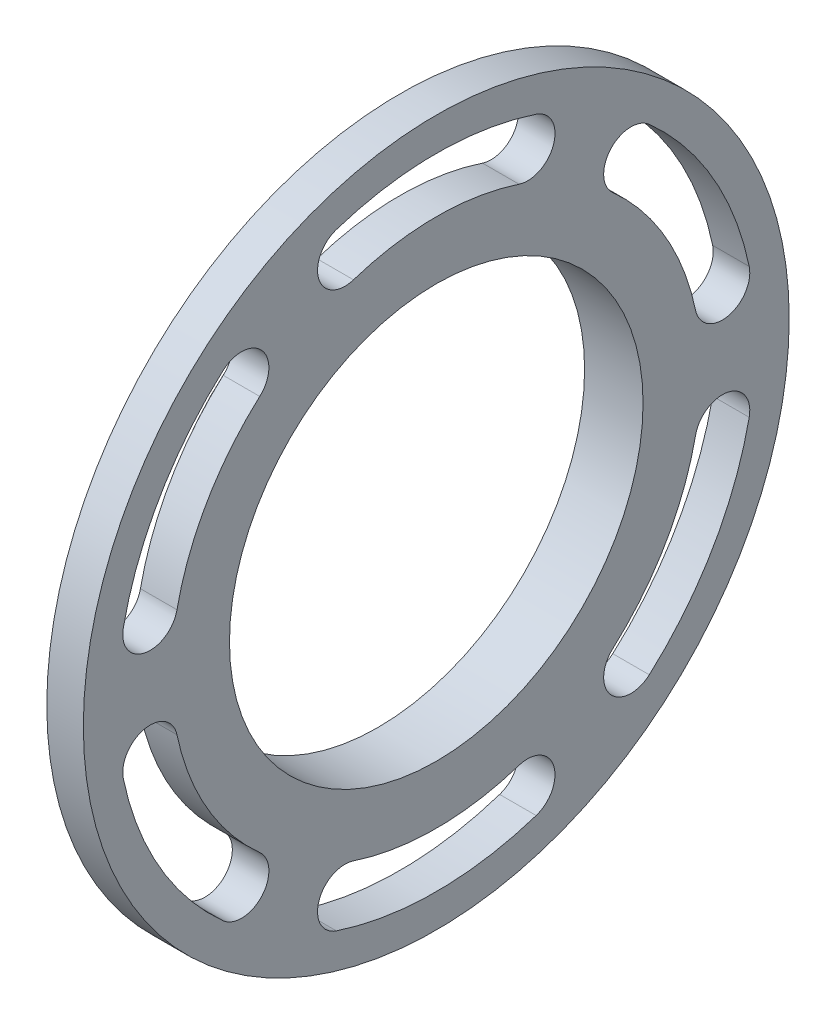
ISO-10303-21;
HEADER;
FILE_DESCRIPTION(('STEP AP214'),'2;1');
FILE_NAME('part.step','',(''),(''),'','','');
FILE_SCHEMA(('AUTOMOTIVE_DESIGN { 1 0 10303 214 1 1 1 1 }'));
ENDSEC;
DATA;
#1=APPLICATION_CONTEXT('core data for automotive mechanical design processes');
#2=APPLICATION_PROTOCOL_DEFINITION('international standard','automotive_design',2000,#1);
#3=PRODUCT_CONTEXT('',#1,'mechanical');
#4=PRODUCT('Part','Part','',(#3));
#5=PRODUCT_RELATED_PRODUCT_CATEGORY('part','',(#4));
#6=PRODUCT_DEFINITION_FORMATION('','',#4);
#7=PRODUCT_DEFINITION_CONTEXT('part definition',#1,'design');
#8=PRODUCT_DEFINITION('design','',#6,#7);
#9=PRODUCT_DEFINITION_SHAPE('','',#8);
#10=(LENGTH_UNIT() NAMED_UNIT(*) SI_UNIT(.MILLI.,.METRE.));
#11=(NAMED_UNIT(*) PLANE_ANGLE_UNIT() SI_UNIT($,.RADIAN.));
#12=(NAMED_UNIT(*) SI_UNIT($,.STERADIAN.) SOLID_ANGLE_UNIT());
#13=UNCERTAINTY_MEASURE_WITH_UNIT(LENGTH_MEASURE(1.E-05),#10,'distance_accuracy_value','');
#14=(GEOMETRIC_REPRESENTATION_CONTEXT(3) GLOBAL_UNCERTAINTY_ASSIGNED_CONTEXT((#13)) GLOBAL_UNIT_ASSIGNED_CONTEXT((#10,
#11,#12)) REPRESENTATION_CONTEXT('',''));
#15=CARTESIAN_POINT('',(0.,0.,0.));
#16=DIRECTION('',(0.,0.,1.));
#17=DIRECTION('',(1.,0.,0.));
#18=AXIS2_PLACEMENT_3D('',#15,#16,#17);
#19=CARTESIAN_POINT('',(6.35,35.941,0.));
#20=DIRECTION('',(1.,0.,0.));
#21=DIRECTION('',(0.,0.,-1.));
#22=AXIS2_PLACEMENT_3D('',#19,#20,#21);
#23=PLANE('',#22);
#24=CARTESIAN_POINT('',(6.35,0.,0.));
#25=DIRECTION('',(1.,0.,0.));
#26=DIRECTION('',(0.,0.866025403784443,0.499999999999992));
#27=AXIS2_PLACEMENT_3D('',#24,#25,#26);
#28=CIRCLE('',#27,55.5625);
#29=CARTESIAN_POINT('',(6.35,-11.352860103282,54.3902930101071));
#30=VERTEX_POINT('',#29);
#31=CARTESIAN_POINT('',(6.35,-41.4269454143902,37.0270117601074));
#32=VERTEX_POINT('',#31);
#33=EDGE_CURVE('E230',#30,#32,#28,.T.);
#34=ORIENTED_EDGE('',*,*,#33,.F.);
#35=CARTESIAN_POINT('',(6.35,-10.379757808715,49.7282678949551));
#36=DIRECTION('',(1.,0.,0.));
#37=DIRECTION('',(0.,-0.866025403784443,-0.499999999999992));
#38=AXIS2_PLACEMENT_3D('',#35,#36,#37);
#39=CIRCLE('',#38,4.7625);
#40=CARTESIAN_POINT('',(6.35,-9.40665551414796,45.066242779803));
#41=VERTEX_POINT('',#40);
#42=EDGE_CURVE('E228',#41,#30,#39,.T.);
#43=ORIENTED_EDGE('',*,*,#42,.F.);
#44=CARTESIAN_POINT('',(6.35,0.,0.));
#45=DIRECTION('',(-1.,0.,0.));
#46=DIRECTION('',(0.,0.866025403784443,0.499999999999992));
#47=AXIS2_PLACEMENT_3D('',#44,#45,#46);
#48=CIRCLE('',#47,46.0375);
#49=CARTESIAN_POINT('',(6.35,-34.3251833433519,30.6795240298033));
#50=VERTEX_POINT('',#49);
#51=EDGE_CURVE('E236',#50,#41,#48,.T.);
#52=ORIENTED_EDGE('',*,*,#51,.F.);
#53=CARTESIAN_POINT('',(6.35,-37.8760643788711,33.8532678949553));
#54=DIRECTION('',(1.,0.,0.));
#55=DIRECTION('',(0.,0.866025403784443,0.499999999999992));
#56=AXIS2_PLACEMENT_3D('',#53,#54,#55);
#57=CIRCLE('',#56,4.7625);
#58=EDGE_CURVE('E233',#32,#50,#57,.T.);
#59=ORIENTED_EDGE('',*,*,#58,.F.);
#60=EDGE_LOOP('',(#34,#43,#52,#59));
#61=FACE_BOUND('',#60,.T.);
#62=CARTESIAN_POINT('',(6.35,0.,0.));
#63=DIRECTION('',(1.,0.,0.));
#64=DIRECTION('',(0.,-0.866025403784436,0.500000000000004));
#65=AXIS2_PLACEMENT_3D('',#62,#63,#64);
#66=CIRCLE('',#65,55.5625);
#67=CARTESIAN_POINT('',(6.35,-41.4269454143908,-37.0270117601068));
#68=VERTEX_POINT('',#67);
#69=CARTESIAN_POINT('',(6.35,-11.3528601032828,-54.390293010107));
#70=VERTEX_POINT('',#69);
#71=EDGE_CURVE('E292',#68,#70,#66,.T.);
#72=ORIENTED_EDGE('',*,*,#71,.F.);
#73=CARTESIAN_POINT('',(6.35,-37.8760643788716,-33.8532678949548));
#74=DIRECTION('',(1.,0.,0.));
#75=DIRECTION('',(0.,0.866025403784436,-0.500000000000004));
#76=AXIS2_PLACEMENT_3D('',#73,#74,#75);
#77=CIRCLE('',#76,4.7625);
#78=CARTESIAN_POINT('',(6.35,-34.3251833433524,-30.6795240298028));
#79=VERTEX_POINT('',#78);
#80=EDGE_CURVE('E290',#79,#68,#77,.T.);
#81=ORIENTED_EDGE('',*,*,#80,.F.);
#82=CARTESIAN_POINT('',(6.35,0.,0.));
#83=DIRECTION('',(-1.,0.,0.));
#84=DIRECTION('',(0.,-0.866025403784436,0.500000000000004));
#85=AXIS2_PLACEMENT_3D('',#82,#83,#84);
#86=CIRCLE('',#85,46.0375);
#87=CARTESIAN_POINT('',(6.35,-9.40665551414859,-45.0662427798029));
#88=VERTEX_POINT('',#87);
#89=EDGE_CURVE('E298',#88,#79,#86,.T.);
#90=ORIENTED_EDGE('',*,*,#89,.F.);
#91=CARTESIAN_POINT('',(6.35,-10.3797578087157,-49.7282678949549));
#92=DIRECTION('',(1.,0.,0.));
#93=DIRECTION('',(0.,-0.866025403784436,0.500000000000004));
#94=AXIS2_PLACEMENT_3D('',#91,#92,#93);
#95=CIRCLE('',#94,4.7625);
#96=EDGE_CURVE('E295',#70,#88,#95,.T.);
#97=ORIENTED_EDGE('',*,*,#96,.F.);
#98=EDGE_LOOP('',(#72,#81,#90,#97));
#99=FACE_BOUND('',#98,.T.);
#100=CARTESIAN_POINT('',(6.35,0.,0.));
#101=DIRECTION('',(1.,0.,0.));
#102=DIRECTION('',(0.,0.,-1.));
#103=AXIS2_PLACEMENT_3D('',#100,#101,#102);
#104=CIRCLE('',#103,55.5625);
#105=CARTESIAN_POINT('',(6.35,52.7798055176731,-17.36328125));
#106=VERTEX_POINT('',#105);
#107=CARTESIAN_POINT('',(6.35,52.7798055176731,17.36328125));
#108=VERTEX_POINT('',#107);
#109=EDGE_CURVE('E354',#106,#108,#104,.T.);
#110=ORIENTED_EDGE('',*,*,#109,.F.);
#111=CARTESIAN_POINT('',(6.35,48.2558221875869,-15.875));
#112=DIRECTION('',(1.,0.,0.));
#113=DIRECTION('',(0.,0.,1.));
#114=AXIS2_PLACEMENT_3D('',#111,#112,#113);
#115=CIRCLE('',#114,4.7625);
#116=CARTESIAN_POINT('',(6.35,43.7318388575006,-14.38671875));
#117=VERTEX_POINT('',#116);
#118=EDGE_CURVE('E352',#117,#106,#115,.T.);
#119=ORIENTED_EDGE('',*,*,#118,.F.);
#120=CARTESIAN_POINT('',(6.35,0.,0.));
#121=DIRECTION('',(-1.,0.,0.));
#122=DIRECTION('',(0.,0.,-1.));
#123=AXIS2_PLACEMENT_3D('',#120,#121,#122);
#124=CIRCLE('',#123,46.0375);
#125=CARTESIAN_POINT('',(6.35,43.7318388575006,14.38671875));
#126=VERTEX_POINT('',#125);
#127=EDGE_CURVE('E360',#126,#117,#124,.T.);
#128=ORIENTED_EDGE('',*,*,#127,.F.);
#129=CARTESIAN_POINT('',(6.35,48.2558221875869,15.875));
#130=DIRECTION('',(1.,0.,0.));
#131=DIRECTION('',(0.,0.,-1.));
#132=AXIS2_PLACEMENT_3D('',#129,#130,#131);
#133=CIRCLE('',#132,4.7625);
#134=EDGE_CURVE('E357',#108,#126,#133,.T.);
#135=ORIENTED_EDGE('',*,*,#134,.F.);
#136=EDGE_LOOP('',(#110,#119,#128,#135));
#137=FACE_BOUND('',#136,.T.);
#138=CARTESIAN_POINT('',(6.35000000000001,0.,0.));
#139=DIRECTION('',(1.,0.,0.));
#140=DIRECTION('',(0.,0.,-1.));
#141=AXIS2_PLACEMENT_3D('',#138,#139,#140);
#142=CIRCLE('',#141,61.341);
#143=CARTESIAN_POINT('',(6.35000000000001,0.,-61.341));
#144=VERTEX_POINT('',#143);
#145=EDGE_CURVE('E39',#144,#144,#142,.T.);
#146=ORIENTED_EDGE('',*,*,#145,.T.);
#147=EDGE_LOOP('',(#146));
#148=FACE_BOUND('',#147,.T.);
#149=CARTESIAN_POINT('',(6.35000000000001,0.,0.));
#150=DIRECTION('',(1.,0.,0.));
#151=DIRECTION('',(0.,0.,-1.));
#152=AXIS2_PLACEMENT_3D('',#149,#150,#151);
#153=CIRCLE('',#152,35.941);
#154=CARTESIAN_POINT('',(6.35000000000001,0.,-35.941));
#155=VERTEX_POINT('',#154);
#156=EDGE_CURVE('E11',#155,#155,#153,.T.);
#157=ORIENTED_EDGE('',*,*,#156,.F.);
#158=EDGE_LOOP('',(#157));
#159=FACE_BOUND('',#158,.T.);
#160=CARTESIAN_POINT('',(6.35,0.,0.));
#161=DIRECTION('',(1.,0.,0.));
#162=DIRECTION('',(0.,-0.86602540378444,-0.499999999999998));
#163=AXIS2_PLACEMENT_3D('',#160,#161,#162);
#164=CIRCLE('',#163,55.5625);
#165=CARTESIAN_POINT('',(6.35,11.3528601032824,-54.390293010107));
#166=VERTEX_POINT('',#165);
#167=CARTESIAN_POINT('',(6.35,41.4269454143905,-37.0270117601071));
#168=VERTEX_POINT('',#167);
#169=EDGE_CURVE('E323',#166,#168,#164,.T.);
#170=ORIENTED_EDGE('',*,*,#169,.F.);
#171=CARTESIAN_POINT('',(6.35,10.3797578087153,-49.728267894955));
#172=DIRECTION('',(1.,0.,0.));
#173=DIRECTION('',(0.,0.86602540378444,0.499999999999998));
#174=AXIS2_PLACEMENT_3D('',#171,#172,#173);
#175=CIRCLE('',#174,4.7625);
#176=CARTESIAN_POINT('',(6.35,9.40665551414828,-45.066242779803));
#177=VERTEX_POINT('',#176);
#178=EDGE_CURVE('E321',#177,#166,#175,.T.);
#179=ORIENTED_EDGE('',*,*,#178,.F.);
#180=CARTESIAN_POINT('',(6.35,0.,0.));
#181=DIRECTION('',(-1.,0.,0.));
#182=DIRECTION('',(0.,-0.86602540378444,-0.499999999999998));
#183=AXIS2_PLACEMENT_3D('',#180,#181,#182);
#184=CIRCLE('',#183,46.0375);
#185=CARTESIAN_POINT('',(6.35,34.3251833433521,-30.679524029803));
#186=VERTEX_POINT('',#185);
#187=EDGE_CURVE('E329',#186,#177,#184,.T.);
#188=ORIENTED_EDGE('',*,*,#187,.F.);
#189=CARTESIAN_POINT('',(6.35,37.8760643788713,-33.8532678949551));
#190=DIRECTION('',(1.,0.,0.));
#191=DIRECTION('',(0.,-0.86602540378444,-0.499999999999998));
#192=AXIS2_PLACEMENT_3D('',#189,#190,#191);
#193=CIRCLE('',#192,4.7625);
#194=EDGE_CURVE('E326',#168,#186,#193,.T.);
#195=ORIENTED_EDGE('',*,*,#194,.F.);
#196=EDGE_LOOP('',(#170,#179,#188,#195));
#197=FACE_BOUND('',#196,.T.);
#198=CARTESIAN_POINT('',(6.35,0.,0.));
#199=DIRECTION('',(1.,0.,0.));
#200=DIRECTION('',(0.,0.,1.));
#201=AXIS2_PLACEMENT_3D('',#198,#199,#200);
#202=CIRCLE('',#201,55.5625);
#203=CARTESIAN_POINT('',(6.35,-52.7798055176731,17.36328125));
#204=VERTEX_POINT('',#203);
#205=CARTESIAN_POINT('',(6.35,-52.7798055176731,-17.36328125));
#206=VERTEX_POINT('',#205);
#207=EDGE_CURVE('E261',#204,#206,#202,.T.);
#208=ORIENTED_EDGE('',*,*,#207,.F.);
#209=CARTESIAN_POINT('',(6.35,-48.2558221875869,15.875));
#210=DIRECTION('',(1.,0.,0.));
#211=DIRECTION('',(0.,0.,-1.));
#212=AXIS2_PLACEMENT_3D('',#209,#210,#211);
#213=CIRCLE('',#212,4.7625);
#214=CARTESIAN_POINT('',(6.35,-43.7318388575006,14.38671875));
#215=VERTEX_POINT('',#214);
#216=EDGE_CURVE('E259',#215,#204,#213,.T.);
#217=ORIENTED_EDGE('',*,*,#216,.F.);
#218=CARTESIAN_POINT('',(6.35,0.,0.));
#219=DIRECTION('',(-1.,0.,0.));
#220=DIRECTION('',(0.,0.,1.));
#221=AXIS2_PLACEMENT_3D('',#218,#219,#220);
#222=CIRCLE('',#221,46.0375);
#223=CARTESIAN_POINT('',(6.35,-43.7318388575006,-14.38671875));
#224=VERTEX_POINT('',#223);
#225=EDGE_CURVE('E267',#224,#215,#222,.T.);
#226=ORIENTED_EDGE('',*,*,#225,.F.);
#227=CARTESIAN_POINT('',(6.35,-48.2558221875869,-15.875));
#228=DIRECTION('',(1.,0.,0.));
#229=DIRECTION('',(0.,0.,1.));
#230=AXIS2_PLACEMENT_3D('',#227,#228,#229);
#231=CIRCLE('',#230,4.7625);
#232=EDGE_CURVE('E264',#206,#224,#231,.T.);
#233=ORIENTED_EDGE('',*,*,#232,.F.);
#234=EDGE_LOOP('',(#208,#217,#226,#233));
#235=FACE_BOUND('',#234,.T.);
#236=CARTESIAN_POINT('',(6.35,0.,0.));
#237=DIRECTION('',(1.,0.,0.));
#238=DIRECTION('',(0.,0.866025403784433,-0.50000000000001));
#239=AXIS2_PLACEMENT_3D('',#236,#237,#238);
#240=CIRCLE('',#239,55.5625);
#241=CARTESIAN_POINT('',(6.35,41.426945414391,37.0270117601065));
#242=VERTEX_POINT('',#241);
#243=CARTESIAN_POINT('',(6.35,11.3528601032832,54.3902930101069));
#244=VERTEX_POINT('',#243);
#245=EDGE_CURVE('E200',#242,#244,#240,.T.);
#246=ORIENTED_EDGE('',*,*,#245,.F.);
#247=CARTESIAN_POINT('',(6.35,37.8760643788718,33.8532678949545));
#248=DIRECTION('',(1.,0.,0.));
#249=DIRECTION('',(0.,-0.866025403784433,0.50000000000001));
#250=AXIS2_PLACEMENT_3D('',#247,#248,#249);
#251=CIRCLE('',#250,4.7625);
#252=CARTESIAN_POINT('',(6.35,34.3251833433526,30.6795240298025));
#253=VERTEX_POINT('',#252);
#254=EDGE_CURVE('E192',#253,#242,#251,.T.);
#255=ORIENTED_EDGE('',*,*,#254,.F.);
#256=CARTESIAN_POINT('',(6.35,0.,0.));
#257=DIRECTION('',(-1.,0.,0.));
#258=DIRECTION('',(0.,0.866025403784433,-0.50000000000001));
#259=AXIS2_PLACEMENT_3D('',#256,#257,#258);
#260=CIRCLE('',#259,46.0375);
#261=CARTESIAN_POINT('',(6.35,9.40665551414891,45.0662427798028));
#262=VERTEX_POINT('',#261);
#263=EDGE_CURVE('E214',#262,#253,#260,.T.);
#264=ORIENTED_EDGE('',*,*,#263,.F.);
#265=CARTESIAN_POINT('',(6.35,10.379757808716,49.7282678949549));
#266=DIRECTION('',(1.,0.,0.));
#267=DIRECTION('',(0.,0.866025403784433,-0.50000000000001));
#268=AXIS2_PLACEMENT_3D('',#265,#266,#267);
#269=CIRCLE('',#268,4.7625);
#270=EDGE_CURVE('E212',#244,#262,#269,.T.);
#271=ORIENTED_EDGE('',*,*,#270,.F.);
#272=EDGE_LOOP('',(#246,#255,#264,#271));
#273=FACE_BOUND('',#272,.T.);
#274=ADVANCED_FACE('F31',(#61,#99,#137,#148,#159,#197,#235,#273),#23,.T.);
#275=CARTESIAN_POINT('',(0.,61.341,0.));
#276=DIRECTION('',(-1.,0.,0.));
#277=DIRECTION('',(0.,0.,1.));
#278=AXIS2_PLACEMENT_3D('',#275,#276,#277);
#279=PLANE('',#278);
#280=CARTESIAN_POINT('',(0.,0.,0.));
#281=DIRECTION('',(-1.,0.,0.));
#282=DIRECTION('',(0.,0.866025403784443,0.499999999999992));
#283=AXIS2_PLACEMENT_3D('',#280,#281,#282);
#284=CIRCLE('',#283,46.0375);
#285=CARTESIAN_POINT('',(0.,-34.3251833433519,30.6795240298033));
#286=VERTEX_POINT('',#285);
#287=CARTESIAN_POINT('',(0.,-9.40665551414796,45.066242779803));
#288=VERTEX_POINT('',#287);
#289=EDGE_CURVE('E231',#286,#288,#284,.T.);
#290=ORIENTED_EDGE('',*,*,#289,.T.);
#291=CARTESIAN_POINT('',(0.,-10.379757808715,49.7282678949551));
#292=DIRECTION('',(1.,0.,0.));
#293=DIRECTION('',(0.,-0.866025403784443,-0.499999999999992));
#294=AXIS2_PLACEMENT_3D('',#291,#292,#293);
#295=CIRCLE('',#294,4.7625);
#296=CARTESIAN_POINT('',(0.,-11.352860103282,54.3902930101071));
#297=VERTEX_POINT('',#296);
#298=EDGE_CURVE('E208',#288,#297,#295,.T.);
#299=ORIENTED_EDGE('',*,*,#298,.T.);
#300=CARTESIAN_POINT('',(0.,0.,0.));
#301=DIRECTION('',(1.,0.,0.));
#302=DIRECTION('',(0.,0.866025403784443,0.499999999999992));
#303=AXIS2_PLACEMENT_3D('',#300,#301,#302);
#304=CIRCLE('',#303,55.5625);
#305=CARTESIAN_POINT('',(0.,-41.4269454143902,37.0270117601074));
#306=VERTEX_POINT('',#305);
#307=EDGE_CURVE('E241',#297,#306,#304,.T.);
#308=ORIENTED_EDGE('',*,*,#307,.T.);
#309=CARTESIAN_POINT('',(0.,-37.8760643788711,33.8532678949553));
#310=DIRECTION('',(1.,0.,0.));
#311=DIRECTION('',(0.,0.866025403784443,0.499999999999992));
#312=AXIS2_PLACEMENT_3D('',#309,#310,#311);
#313=CIRCLE('',#312,4.7625);
#314=EDGE_CURVE('E244',#306,#286,#313,.T.);
#315=ORIENTED_EDGE('',*,*,#314,.T.);
#316=EDGE_LOOP('',(#290,#299,#308,#315));
#317=FACE_BOUND('',#316,.T.);
#318=CARTESIAN_POINT('',(0.,0.,0.));
#319=DIRECTION('',(-1.,0.,0.));
#320=DIRECTION('',(0.,-0.866025403784436,0.500000000000004));
#321=AXIS2_PLACEMENT_3D('',#318,#319,#320);
#322=CIRCLE('',#321,46.0375);
#323=CARTESIAN_POINT('',(0.,-9.4066555141486,-45.0662427798029));
#324=VERTEX_POINT('',#323);
#325=CARTESIAN_POINT('',(0.,-34.3251833433523,-30.6795240298028));
#326=VERTEX_POINT('',#325);
#327=EDGE_CURVE('E293',#324,#326,#322,.T.);
#328=ORIENTED_EDGE('',*,*,#327,.T.);
#329=CARTESIAN_POINT('',(0.,-37.8760643788716,-33.8532678949548));
#330=DIRECTION('',(1.,0.,0.));
#331=DIRECTION('',(0.,0.866025403784436,-0.500000000000004));
#332=AXIS2_PLACEMENT_3D('',#329,#330,#331);
#333=CIRCLE('',#332,4.7625);
#334=CARTESIAN_POINT('',(0.,-41.4269454143908,-37.0270117601068));
#335=VERTEX_POINT('',#334);
#336=EDGE_CURVE('E289',#326,#335,#333,.T.);
#337=ORIENTED_EDGE('',*,*,#336,.T.);
#338=CARTESIAN_POINT('',(0.,0.,0.));
#339=DIRECTION('',(1.,0.,0.));
#340=DIRECTION('',(0.,-0.866025403784436,0.500000000000004));
#341=AXIS2_PLACEMENT_3D('',#338,#339,#340);
#342=CIRCLE('',#341,55.5625);
#343=CARTESIAN_POINT('',(0.,-11.3528601032828,-54.390293010107));
#344=VERTEX_POINT('',#343);
#345=EDGE_CURVE('E303',#335,#344,#342,.T.);
#346=ORIENTED_EDGE('',*,*,#345,.T.);
#347=CARTESIAN_POINT('',(0.,-10.3797578087157,-49.7282678949549));
#348=DIRECTION('',(1.,0.,0.));
#349=DIRECTION('',(0.,-0.866025403784436,0.500000000000004));
#350=AXIS2_PLACEMENT_3D('',#347,#348,#349);
#351=CIRCLE('',#350,4.7625);
#352=EDGE_CURVE('E306',#344,#324,#351,.T.);
#353=ORIENTED_EDGE('',*,*,#352,.T.);
#354=EDGE_LOOP('',(#328,#337,#346,#353));
#355=FACE_BOUND('',#354,.T.);
#356=CARTESIAN_POINT('',(0.,0.,0.));
#357=DIRECTION('',(-1.,0.,0.));
#358=DIRECTION('',(0.,0.,-1.));
#359=AXIS2_PLACEMENT_3D('',#356,#357,#358);
#360=CIRCLE('',#359,46.0375);
#361=CARTESIAN_POINT('',(0.,43.7318388575006,14.38671875));
#362=VERTEX_POINT('',#361);
#363=CARTESIAN_POINT('',(0.,43.7318388575006,-14.38671875));
#364=VERTEX_POINT('',#363);
#365=EDGE_CURVE('E355',#362,#364,#360,.T.);
#366=ORIENTED_EDGE('',*,*,#365,.T.);
#367=CARTESIAN_POINT('',(0.,48.2558221875869,-15.875));
#368=DIRECTION('',(1.,0.,0.));
#369=DIRECTION('',(0.,0.,1.));
#370=AXIS2_PLACEMENT_3D('',#367,#368,#369);
#371=CIRCLE('',#370,4.7625);
#372=CARTESIAN_POINT('',(0.,52.7798055176731,-17.36328125));
#373=VERTEX_POINT('',#372);
#374=EDGE_CURVE('E351',#364,#373,#371,.T.);
#375=ORIENTED_EDGE('',*,*,#374,.T.);
#376=CARTESIAN_POINT('',(0.,0.,0.));
#377=DIRECTION('',(1.,0.,0.));
#378=DIRECTION('',(0.,0.,-1.));
#379=AXIS2_PLACEMENT_3D('',#376,#377,#378);
#380=CIRCLE('',#379,55.5625);
#381=CARTESIAN_POINT('',(0.,52.7798055176731,17.36328125));
#382=VERTEX_POINT('',#381);
#383=EDGE_CURVE('E365',#373,#382,#380,.T.);
#384=ORIENTED_EDGE('',*,*,#383,.T.);
#385=CARTESIAN_POINT('',(0.,48.2558221875869,15.875));
#386=DIRECTION('',(1.,0.,0.));
#387=DIRECTION('',(0.,0.,-1.));
#388=AXIS2_PLACEMENT_3D('',#385,#386,#387);
#389=CIRCLE('',#388,4.7625);
#390=EDGE_CURVE('E368',#382,#362,#389,.T.);
#391=ORIENTED_EDGE('',*,*,#390,.T.);
#392=EDGE_LOOP('',(#366,#375,#384,#391));
#393=FACE_BOUND('',#392,.T.);
#394=CARTESIAN_POINT('',(0.,0.,0.));
#395=DIRECTION('',(1.,0.,0.));
#396=DIRECTION('',(0.,0.,-1.));
#397=AXIS2_PLACEMENT_3D('',#394,#395,#396);
#398=CIRCLE('',#397,40.7035);
#399=CARTESIAN_POINT('',(0.,0.,-40.7035));
#400=VERTEX_POINT('',#399);
#401=EDGE_CURVE('E388',#400,#400,#398,.T.);
#402=ORIENTED_EDGE('',*,*,#401,.T.);
#403=EDGE_LOOP('',(#402));
#404=FACE_BOUND('',#403,.T.);
#405=CARTESIAN_POINT('',(0.,0.,0.));
#406=DIRECTION('',(1.,0.,0.));
#407=DIRECTION('',(0.,0.,-1.));
#408=AXIS2_PLACEMENT_3D('',#405,#406,#407);
#409=CIRCLE('',#408,61.341);
#410=CARTESIAN_POINT('',(0.,0.,-61.341));
#411=VERTEX_POINT('',#410);
#412=EDGE_CURVE('E391',#411,#411,#409,.T.);
#413=ORIENTED_EDGE('',*,*,#412,.F.);
#414=EDGE_LOOP('',(#413));
#415=FACE_BOUND('',#414,.T.);
#416=CARTESIAN_POINT('',(0.,0.,0.));
#417=DIRECTION('',(-1.,0.,0.));
#418=DIRECTION('',(0.,-0.86602540378444,-0.499999999999998));
#419=AXIS2_PLACEMENT_3D('',#416,#417,#418);
#420=CIRCLE('',#419,46.0375);
#421=CARTESIAN_POINT('',(0.,34.3251833433521,-30.679524029803));
#422=VERTEX_POINT('',#421);
#423=CARTESIAN_POINT('',(0.,9.40665551414828,-45.066242779803));
#424=VERTEX_POINT('',#423);
#425=EDGE_CURVE('E324',#422,#424,#420,.T.);
#426=ORIENTED_EDGE('',*,*,#425,.T.);
#427=CARTESIAN_POINT('',(0.,10.3797578087153,-49.728267894955));
#428=DIRECTION('',(1.,0.,0.));
#429=DIRECTION('',(0.,0.86602540378444,0.499999999999998));
#430=AXIS2_PLACEMENT_3D('',#427,#428,#429);
#431=CIRCLE('',#430,4.7625);
#432=CARTESIAN_POINT('',(0.,11.3528601032824,-54.390293010107));
#433=VERTEX_POINT('',#432);
#434=EDGE_CURVE('E320',#424,#433,#431,.T.);
#435=ORIENTED_EDGE('',*,*,#434,.T.);
#436=CARTESIAN_POINT('',(0.,0.,0.));
#437=DIRECTION('',(1.,0.,0.));
#438=DIRECTION('',(0.,-0.86602540378444,-0.499999999999998));
#439=AXIS2_PLACEMENT_3D('',#436,#437,#438);
#440=CIRCLE('',#439,55.5625);
#441=CARTESIAN_POINT('',(0.,41.4269454143905,-37.0270117601071));
#442=VERTEX_POINT('',#441);
#443=EDGE_CURVE('E334',#433,#442,#440,.T.);
#444=ORIENTED_EDGE('',*,*,#443,.T.);
#445=CARTESIAN_POINT('',(0.,37.8760643788713,-33.8532678949551));
#446=DIRECTION('',(1.,0.,0.));
#447=DIRECTION('',(0.,-0.86602540378444,-0.499999999999998));
#448=AXIS2_PLACEMENT_3D('',#445,#446,#447);
#449=CIRCLE('',#448,4.7625);
#450=EDGE_CURVE('E337',#442,#422,#449,.T.);
#451=ORIENTED_EDGE('',*,*,#450,.T.);
#452=EDGE_LOOP('',(#426,#435,#444,#451));
#453=FACE_BOUND('',#452,.T.);
#454=CARTESIAN_POINT('',(0.,0.,0.));
#455=DIRECTION('',(-1.,0.,0.));
#456=DIRECTION('',(0.,0.,1.));
#457=AXIS2_PLACEMENT_3D('',#454,#455,#456);
#458=CIRCLE('',#457,46.0375);
#459=CARTESIAN_POINT('',(0.,-43.7318388575006,-14.38671875));
#460=VERTEX_POINT('',#459);
#461=CARTESIAN_POINT('',(0.,-43.7318388575006,14.38671875));
#462=VERTEX_POINT('',#461);
#463=EDGE_CURVE('E262',#460,#462,#458,.T.);
#464=ORIENTED_EDGE('',*,*,#463,.T.);
#465=CARTESIAN_POINT('',(0.,-48.2558221875869,15.875));
#466=DIRECTION('',(1.,0.,0.));
#467=DIRECTION('',(0.,0.,-1.));
#468=AXIS2_PLACEMENT_3D('',#465,#466,#467);
#469=CIRCLE('',#468,4.7625);
#470=CARTESIAN_POINT('',(0.,-52.7798055176731,17.36328125));
#471=VERTEX_POINT('',#470);
#472=EDGE_CURVE('E258',#462,#471,#469,.T.);
#473=ORIENTED_EDGE('',*,*,#472,.T.);
#474=CARTESIAN_POINT('',(0.,0.,0.));
#475=DIRECTION('',(1.,0.,0.));
#476=DIRECTION('',(0.,0.,1.));
#477=AXIS2_PLACEMENT_3D('',#474,#475,#476);
#478=CIRCLE('',#477,55.5625);
#479=CARTESIAN_POINT('',(0.,-52.7798055176731,-17.36328125));
#480=VERTEX_POINT('',#479);
#481=EDGE_CURVE('E272',#471,#480,#478,.T.);
#482=ORIENTED_EDGE('',*,*,#481,.T.);
#483=CARTESIAN_POINT('',(0.,-48.2558221875869,-15.875));
#484=DIRECTION('',(1.,0.,0.));
#485=DIRECTION('',(0.,0.,1.));
#486=AXIS2_PLACEMENT_3D('',#483,#484,#485);
#487=CIRCLE('',#486,4.7625);
#488=EDGE_CURVE('E275',#480,#460,#487,.T.);
#489=ORIENTED_EDGE('',*,*,#488,.T.);
#490=EDGE_LOOP('',(#464,#473,#482,#489));
#491=FACE_BOUND('',#490,.T.);
#492=CARTESIAN_POINT('',(0.,0.,0.));
#493=DIRECTION('',(-1.,0.,0.));
#494=DIRECTION('',(0.,0.866025403784433,-0.50000000000001));
#495=AXIS2_PLACEMENT_3D('',#492,#493,#494);
#496=CIRCLE('',#495,46.0375);
#497=CARTESIAN_POINT('',(0.,9.40665551414891,45.0662427798028));
#498=VERTEX_POINT('',#497);
#499=CARTESIAN_POINT('',(0.,34.3251833433526,30.6795240298025));
#500=VERTEX_POINT('',#499);
#501=EDGE_CURVE('E201',#498,#500,#496,.T.);
#502=ORIENTED_EDGE('',*,*,#501,.T.);
#503=CARTESIAN_POINT('',(0.,37.8760643788718,33.8532678949545));
#504=DIRECTION('',(1.,0.,0.));
#505=DIRECTION('',(0.,-0.866025403784433,0.50000000000001));
#506=AXIS2_PLACEMENT_3D('',#503,#504,#505);
#507=CIRCLE('',#506,4.7625);
#508=CARTESIAN_POINT('',(0.,41.426945414391,37.0270117601065));
#509=VERTEX_POINT('',#508);
#510=EDGE_CURVE('E54',#500,#509,#507,.T.);
#511=ORIENTED_EDGE('',*,*,#510,.T.);
#512=CARTESIAN_POINT('',(0.,0.,0.));
#513=DIRECTION('',(1.,0.,0.));
#514=DIRECTION('',(0.,0.866025403784433,-0.50000000000001));
#515=AXIS2_PLACEMENT_3D('',#512,#513,#514);
#516=CIRCLE('',#515,55.5625);
#517=CARTESIAN_POINT('',(0.,11.3528601032832,54.3902930101069));
#518=VERTEX_POINT('',#517);
#519=EDGE_CURVE('E207',#509,#518,#516,.T.);
#520=ORIENTED_EDGE('',*,*,#519,.T.);
#521=CARTESIAN_POINT('',(0.,10.379757808716,49.7282678949549));
#522=DIRECTION('',(1.,0.,0.));
#523=DIRECTION('',(0.,0.866025403784433,-0.50000000000001));
#524=AXIS2_PLACEMENT_3D('',#521,#522,#523);
#525=CIRCLE('',#524,4.7625);
#526=EDGE_CURVE('E220',#518,#498,#525,.T.);
#527=ORIENTED_EDGE('',*,*,#526,.T.);
#528=EDGE_LOOP('',(#502,#511,#520,#527));
#529=FACE_BOUND('',#528,.T.);
#530=ADVANCED_FACE('F410',(#317,#355,#393,#404,#415,#453,#491,#529),#279,.T.);
#531=CARTESIAN_POINT('',(88.99,0.,0.));
#532=DIRECTION('',(1.,0.,0.));
#533=DIRECTION('',(0.,0.,-1.));
#534=AXIS2_PLACEMENT_3D('',#531,#532,#533);
#535=CYLINDRICAL_SURFACE('',#534,35.941);
#536=ORIENTED_EDGE('',*,*,#156,.T.);
#537=EDGE_LOOP('',(#536));
#538=FACE_BOUND('',#537,.T.);
#539=CARTESIAN_POINT('',(-3.80999999999999,0.,0.));
#540=DIRECTION('',(1.,0.,0.));
#541=DIRECTION('',(0.,0.,-1.));
#542=AXIS2_PLACEMENT_3D('',#539,#540,#541);
#543=CIRCLE('',#542,35.941);
#544=CARTESIAN_POINT('',(-3.80999999999999,0.,-35.941));
#545=VERTEX_POINT('',#544);
#546=EDGE_CURVE('E382',#545,#545,#543,.T.);
#547=ORIENTED_EDGE('',*,*,#546,.F.);
#548=EDGE_LOOP('',(#547));
#549=FACE_BOUND('',#548,.T.);
#550=ADVANCED_FACE('F33',(#538,#549),#535,.F.);
#551=CARTESIAN_POINT('',(88.99,0.,0.));
#552=DIRECTION('',(1.,0.,0.));
#553=DIRECTION('',(0.,0.,-1.));
#554=AXIS2_PLACEMENT_3D('',#551,#552,#553);
#555=CYLINDRICAL_SURFACE('',#554,61.341);
#556=ORIENTED_EDGE('',*,*,#412,.T.);
#557=EDGE_LOOP('',(#556));
#558=FACE_BOUND('',#557,.T.);
#559=ORIENTED_EDGE('',*,*,#145,.F.);
#560=EDGE_LOOP('',(#559));
#561=FACE_BOUND('',#560,.T.);
#562=ADVANCED_FACE('F398',(#558,#561),#555,.T.);
#563=CARTESIAN_POINT('',(88.99,0.,0.));
#564=DIRECTION('',(1.,0.,0.));
#565=DIRECTION('',(0.,0.,-1.));
#566=AXIS2_PLACEMENT_3D('',#563,#564,#565);
#567=CYLINDRICAL_SURFACE('',#566,40.7035);
#568=CARTESIAN_POINT('',(-3.80999999999999,0.,0.));
#569=DIRECTION('',(1.,0.,0.));
#570=DIRECTION('',(0.,0.,-1.));
#571=AXIS2_PLACEMENT_3D('',#568,#569,#570);
#572=CIRCLE('',#571,40.7035);
#573=CARTESIAN_POINT('',(-3.80999999999999,0.,-40.7035));
#574=VERTEX_POINT('',#573);
#575=EDGE_CURVE('E385',#574,#574,#572,.T.);
#576=ORIENTED_EDGE('',*,*,#575,.T.);
#577=EDGE_LOOP('',(#576));
#578=FACE_BOUND('',#577,.T.);
#579=ORIENTED_EDGE('',*,*,#401,.F.);
#580=EDGE_LOOP('',(#579));
#581=FACE_BOUND('',#580,.T.);
#582=ADVANCED_FACE('F400',(#578,#581),#567,.T.);
#583=CARTESIAN_POINT('',(-3.81,40.7035,0.));
#584=DIRECTION('',(-1.,0.,0.));
#585=DIRECTION('',(0.,0.,1.));
#586=AXIS2_PLACEMENT_3D('',#583,#584,#585);
#587=PLANE('',#586);
#588=ORIENTED_EDGE('',*,*,#546,.T.);
#589=EDGE_LOOP('',(#588));
#590=FACE_BOUND('',#589,.T.);
#591=ORIENTED_EDGE('',*,*,#575,.F.);
#592=EDGE_LOOP('',(#591));
#593=FACE_BOUND('',#592,.T.);
#594=ADVANCED_FACE('F407',(#590,#593),#587,.T.);
#595=CARTESIAN_POINT('',(6.35,48.2558221875869,-15.875));
#596=DIRECTION('',(-1.,0.,0.));
#597=DIRECTION('',(0.,0.,1.));
#598=AXIS2_PLACEMENT_3D('',#595,#596,#597);
#599=CYLINDRICAL_SURFACE('',#598,4.7625);
#600=ORIENTED_EDGE('',*,*,#374,.F.);
#601=DIRECTION('',(-1.,0.,0.));
#602=VECTOR('',#601,1.);
#603=CARTESIAN_POINT('',(6.35,43.7318388575006,-14.38671875));
#604=LINE('',#603,#602);
#605=EDGE_CURVE('E362',#117,#364,#604,.T.);
#606=ORIENTED_EDGE('',*,*,#605,.F.);
#607=ORIENTED_EDGE('',*,*,#118,.T.);
#608=DIRECTION('',(-1.,0.,0.));
#609=VECTOR('',#608,1.);
#610=CARTESIAN_POINT('',(6.35,52.7798055176731,-17.36328125));
#611=LINE('',#610,#609);
#612=EDGE_CURVE('E379',#106,#373,#611,.T.);
#613=ORIENTED_EDGE('',*,*,#612,.T.);
#614=EDGE_LOOP('',(#600,#606,#607,#613));
#615=FACE_BOUND('',#614,.T.);
#616=ADVANCED_FACE('F442',(#615),#599,.F.);
#617=CARTESIAN_POINT('',(6.35,0.,0.));
#618=DIRECTION('',(-1.,0.,0.));
#619=DIRECTION('',(0.,0.,1.));
#620=AXIS2_PLACEMENT_3D('',#617,#618,#619);
#621=CYLINDRICAL_SURFACE('',#620,55.5625);
#622=ORIENTED_EDGE('',*,*,#383,.F.);
#623=ORIENTED_EDGE('',*,*,#612,.F.);
#624=ORIENTED_EDGE('',*,*,#109,.T.);
#625=DIRECTION('',(-1.,0.,0.));
#626=VECTOR('',#625,1.);
#627=CARTESIAN_POINT('',(6.35,52.7798055176731,17.36328125));
#628=LINE('',#627,#626);
#629=EDGE_CURVE('E377',#108,#382,#628,.T.);
#630=ORIENTED_EDGE('',*,*,#629,.T.);
#631=EDGE_LOOP('',(#622,#623,#624,#630));
#632=FACE_BOUND('',#631,.T.);
#633=ADVANCED_FACE('F434',(#632),#621,.F.);
#634=CARTESIAN_POINT('',(6.35,48.2558221875869,15.875));
#635=DIRECTION('',(-1.,0.,0.));
#636=DIRECTION('',(0.,0.,1.));
#637=AXIS2_PLACEMENT_3D('',#634,#635,#636);
#638=CYLINDRICAL_SURFACE('',#637,4.7625);
#639=ORIENTED_EDGE('',*,*,#390,.F.);
#640=ORIENTED_EDGE('',*,*,#629,.F.);
#641=ORIENTED_EDGE('',*,*,#134,.T.);
#642=DIRECTION('',(-1.,0.,0.));
#643=VECTOR('',#642,1.);
#644=CARTESIAN_POINT('',(6.35,43.7318388575006,14.38671875));
#645=LINE('',#644,#643);
#646=EDGE_CURVE('E375',#126,#362,#645,.T.);
#647=ORIENTED_EDGE('',*,*,#646,.T.);
#648=EDGE_LOOP('',(#639,#640,#641,#647));
#649=FACE_BOUND('',#648,.T.);
#650=ADVANCED_FACE('F437',(#649),#638,.F.);
#651=CARTESIAN_POINT('',(6.35,0.,0.));
#652=DIRECTION('',(-1.,0.,0.));
#653=DIRECTION('',(0.,0.,1.));
#654=AXIS2_PLACEMENT_3D('',#651,#652,#653);
#655=CYLINDRICAL_SURFACE('',#654,46.0375);
#656=ORIENTED_EDGE('',*,*,#365,.F.);
#657=ORIENTED_EDGE('',*,*,#646,.F.);
#658=ORIENTED_EDGE('',*,*,#127,.T.);
#659=ORIENTED_EDGE('',*,*,#605,.T.);
#660=EDGE_LOOP('',(#656,#657,#658,#659));
#661=FACE_BOUND('',#660,.T.);
#662=ADVANCED_FACE('F445',(#661),#655,.T.);
#663=CARTESIAN_POINT('',(6.35,10.3797578087153,-49.728267894955));
#664=DIRECTION('',(-1.,0.,0.));
#665=DIRECTION('',(0.,0.,1.));
#666=AXIS2_PLACEMENT_3D('',#663,#664,#665);
#667=CYLINDRICAL_SURFACE('',#666,4.7625);
#668=ORIENTED_EDGE('',*,*,#434,.F.);
#669=DIRECTION('',(-1.,0.,0.));
#670=VECTOR('',#669,1.);
#671=CARTESIAN_POINT('',(6.35,9.40665551414828,-45.066242779803));
#672=LINE('',#671,#670);
#673=EDGE_CURVE('E331',#177,#424,#672,.T.);
#674=ORIENTED_EDGE('',*,*,#673,.F.);
#675=ORIENTED_EDGE('',*,*,#178,.T.);
#676=DIRECTION('',(-1.,0.,0.));
#677=VECTOR('',#676,1.);
#678=CARTESIAN_POINT('',(6.35,11.3528601032824,-54.390293010107));
#679=LINE('',#678,#677);
#680=EDGE_CURVE('E348',#166,#433,#679,.T.);
#681=ORIENTED_EDGE('',*,*,#680,.T.);
#682=EDGE_LOOP('',(#668,#674,#675,#681));
#683=FACE_BOUND('',#682,.T.);
#684=ADVANCED_FACE('F447',(#683),#667,.F.);
#685=CARTESIAN_POINT('',(6.35,0.,0.));
#686=DIRECTION('',(-1.,0.,0.));
#687=DIRECTION('',(0.,0.,1.));
#688=AXIS2_PLACEMENT_3D('',#685,#686,#687);
#689=CYLINDRICAL_SURFACE('',#688,55.5625);
#690=ORIENTED_EDGE('',*,*,#443,.F.);
#691=ORIENTED_EDGE('',*,*,#680,.F.);
#692=ORIENTED_EDGE('',*,*,#169,.T.);
#693=DIRECTION('',(-1.,0.,0.));
#694=VECTOR('',#693,1.);
#695=CARTESIAN_POINT('',(6.35,41.4269454143905,-37.0270117601071));
#696=LINE('',#695,#694);
#697=EDGE_CURVE('E346',#168,#442,#696,.T.);
#698=ORIENTED_EDGE('',*,*,#697,.T.);
#699=EDGE_LOOP('',(#690,#691,#692,#698));
#700=FACE_BOUND('',#699,.T.);
#701=ADVANCED_FACE('F453',(#700),#689,.F.);
#702=CARTESIAN_POINT('',(6.35,37.8760643788713,-33.8532678949551));
#703=DIRECTION('',(-1.,0.,0.));
#704=DIRECTION('',(0.,0.,1.));
#705=AXIS2_PLACEMENT_3D('',#702,#703,#704);
#706=CYLINDRICAL_SURFACE('',#705,4.7625);
#707=ORIENTED_EDGE('',*,*,#450,.F.);
#708=ORIENTED_EDGE('',*,*,#697,.F.);
#709=ORIENTED_EDGE('',*,*,#194,.T.);
#710=DIRECTION('',(-1.,0.,0.));
#711=VECTOR('',#710,1.);
#712=CARTESIAN_POINT('',(6.35,34.3251833433521,-30.679524029803));
#713=LINE('',#712,#711);
#714=EDGE_CURVE('E344',#186,#422,#713,.T.);
#715=ORIENTED_EDGE('',*,*,#714,.T.);
#716=EDGE_LOOP('',(#707,#708,#709,#715));
#717=FACE_BOUND('',#716,.T.);
#718=ADVANCED_FACE('F545',(#717),#706,.F.);
#719=CARTESIAN_POINT('',(6.35,0.,0.));
#720=DIRECTION('',(-1.,0.,0.));
#721=DIRECTION('',(0.,0.,1.));
#722=AXIS2_PLACEMENT_3D('',#719,#720,#721);
#723=CYLINDRICAL_SURFACE('',#722,46.0375);
#724=ORIENTED_EDGE('',*,*,#425,.F.);
#725=ORIENTED_EDGE('',*,*,#714,.F.);
#726=ORIENTED_EDGE('',*,*,#187,.T.);
#727=ORIENTED_EDGE('',*,*,#673,.T.);
#728=EDGE_LOOP('',(#724,#725,#726,#727));
#729=FACE_BOUND('',#728,.T.);
#730=ADVANCED_FACE('F541',(#729),#723,.T.);
#731=CARTESIAN_POINT('',(6.35,-37.8760643788716,-33.8532678949548));
#732=DIRECTION('',(-1.,0.,0.));
#733=DIRECTION('',(0.,0.,1.));
#734=AXIS2_PLACEMENT_3D('',#731,#732,#733);
#735=CYLINDRICAL_SURFACE('',#734,4.7625);
#736=ORIENTED_EDGE('',*,*,#336,.F.);
#737=DIRECTION('',(-1.,0.,0.));
#738=VECTOR('',#737,1.);
#739=CARTESIAN_POINT('',(6.35,-34.3251833433524,-30.6795240298028));
#740=LINE('',#739,#738);
#741=EDGE_CURVE('E300',#79,#326,#740,.T.);
#742=ORIENTED_EDGE('',*,*,#741,.F.);
#743=ORIENTED_EDGE('',*,*,#80,.T.);
#744=DIRECTION('',(-1.,0.,0.));
#745=VECTOR('',#744,1.);
#746=CARTESIAN_POINT('',(6.35,-41.4269454143908,-37.0270117601068));
#747=LINE('',#746,#745);
#748=EDGE_CURVE('E317',#68,#335,#747,.T.);
#749=ORIENTED_EDGE('',*,*,#748,.T.);
#750=EDGE_LOOP('',(#736,#742,#743,#749));
#751=FACE_BOUND('',#750,.T.);
#752=ADVANCED_FACE('F537',(#751),#735,.F.);
#753=CARTESIAN_POINT('',(6.35,0.,0.));
#754=DIRECTION('',(-1.,0.,0.));
#755=DIRECTION('',(0.,0.,1.));
#756=AXIS2_PLACEMENT_3D('',#753,#754,#755);
#757=CYLINDRICAL_SURFACE('',#756,55.5625);
#758=ORIENTED_EDGE('',*,*,#345,.F.);
#759=ORIENTED_EDGE('',*,*,#748,.F.);
#760=ORIENTED_EDGE('',*,*,#71,.T.);
#761=DIRECTION('',(-1.,0.,0.));
#762=VECTOR('',#761,1.);
#763=CARTESIAN_POINT('',(6.35,-11.3528601032828,-54.390293010107));
#764=LINE('',#763,#762);
#765=EDGE_CURVE('E315',#70,#344,#764,.T.);
#766=ORIENTED_EDGE('',*,*,#765,.T.);
#767=EDGE_LOOP('',(#758,#759,#760,#766));
#768=FACE_BOUND('',#767,.T.);
#769=ADVANCED_FACE('F533',(#768),#757,.F.);
#770=CARTESIAN_POINT('',(6.35,-10.3797578087157,-49.7282678949549));
#771=DIRECTION('',(-1.,0.,0.));
#772=DIRECTION('',(0.,0.,1.));
#773=AXIS2_PLACEMENT_3D('',#770,#771,#772);
#774=CYLINDRICAL_SURFACE('',#773,4.7625);
#775=ORIENTED_EDGE('',*,*,#352,.F.);
#776=ORIENTED_EDGE('',*,*,#765,.F.);
#777=ORIENTED_EDGE('',*,*,#96,.T.);
#778=DIRECTION('',(-1.,0.,0.));
#779=VECTOR('',#778,1.);
#780=CARTESIAN_POINT('',(6.35,-9.4066555141486,-45.0662427798029));
#781=LINE('',#780,#779);
#782=EDGE_CURVE('E313',#88,#324,#781,.T.);
#783=ORIENTED_EDGE('',*,*,#782,.T.);
#784=EDGE_LOOP('',(#775,#776,#777,#783));
#785=FACE_BOUND('',#784,.T.);
#786=ADVANCED_FACE('F529',(#785),#774,.F.);
#787=CARTESIAN_POINT('',(6.35,0.,0.));
#788=DIRECTION('',(-1.,0.,0.));
#789=DIRECTION('',(0.,0.,1.));
#790=AXIS2_PLACEMENT_3D('',#787,#788,#789);
#791=CYLINDRICAL_SURFACE('',#790,46.0375);
#792=ORIENTED_EDGE('',*,*,#327,.F.);
#793=ORIENTED_EDGE('',*,*,#782,.F.);
#794=ORIENTED_EDGE('',*,*,#89,.T.);
#795=ORIENTED_EDGE('',*,*,#741,.T.);
#796=EDGE_LOOP('',(#792,#793,#794,#795));
#797=FACE_BOUND('',#796,.T.);
#798=ADVANCED_FACE('F525',(#797),#791,.T.);
#799=CARTESIAN_POINT('',(6.35,-48.2558221875869,15.875));
#800=DIRECTION('',(-1.,0.,0.));
#801=DIRECTION('',(0.,0.,1.));
#802=AXIS2_PLACEMENT_3D('',#799,#800,#801);
#803=CYLINDRICAL_SURFACE('',#802,4.7625);
#804=ORIENTED_EDGE('',*,*,#472,.F.);
#805=DIRECTION('',(-1.,0.,0.));
#806=VECTOR('',#805,1.);
#807=CARTESIAN_POINT('',(6.35,-43.7318388575006,14.38671875));
#808=LINE('',#807,#806);
#809=EDGE_CURVE('E269',#215,#462,#808,.T.);
#810=ORIENTED_EDGE('',*,*,#809,.F.);
#811=ORIENTED_EDGE('',*,*,#216,.T.);
#812=DIRECTION('',(-1.,0.,0.));
#813=VECTOR('',#812,1.);
#814=CARTESIAN_POINT('',(6.35,-52.7798055176731,17.36328125));
#815=LINE('',#814,#813);
#816=EDGE_CURVE('E286',#204,#471,#815,.T.);
#817=ORIENTED_EDGE('',*,*,#816,.T.);
#818=EDGE_LOOP('',(#804,#810,#811,#817));
#819=FACE_BOUND('',#818,.T.);
#820=ADVANCED_FACE('F521',(#819),#803,.F.);
#821=CARTESIAN_POINT('',(6.35,0.,0.));
#822=DIRECTION('',(-1.,0.,0.));
#823=DIRECTION('',(0.,0.,1.));
#824=AXIS2_PLACEMENT_3D('',#821,#822,#823);
#825=CYLINDRICAL_SURFACE('',#824,55.5625);
#826=ORIENTED_EDGE('',*,*,#481,.F.);
#827=ORIENTED_EDGE('',*,*,#816,.F.);
#828=ORIENTED_EDGE('',*,*,#207,.T.);
#829=DIRECTION('',(-1.,0.,0.));
#830=VECTOR('',#829,1.);
#831=CARTESIAN_POINT('',(6.35,-52.7798055176731,-17.36328125));
#832=LINE('',#831,#830);
#833=EDGE_CURVE('E284',#206,#480,#832,.T.);
#834=ORIENTED_EDGE('',*,*,#833,.T.);
#835=EDGE_LOOP('',(#826,#827,#828,#834));
#836=FACE_BOUND('',#835,.T.);
#837=ADVANCED_FACE('F517',(#836),#825,.F.);
#838=CARTESIAN_POINT('',(6.35,-48.2558221875869,-15.875));
#839=DIRECTION('',(-1.,0.,0.));
#840=DIRECTION('',(0.,0.,1.));
#841=AXIS2_PLACEMENT_3D('',#838,#839,#840);
#842=CYLINDRICAL_SURFACE('',#841,4.7625);
#843=ORIENTED_EDGE('',*,*,#488,.F.);
#844=ORIENTED_EDGE('',*,*,#833,.F.);
#845=ORIENTED_EDGE('',*,*,#232,.T.);
#846=DIRECTION('',(-1.,0.,0.));
#847=VECTOR('',#846,1.);
#848=CARTESIAN_POINT('',(6.35,-43.7318388575006,-14.38671875));
#849=LINE('',#848,#847);
#850=EDGE_CURVE('E282',#224,#460,#849,.T.);
#851=ORIENTED_EDGE('',*,*,#850,.T.);
#852=EDGE_LOOP('',(#843,#844,#845,#851));
#853=FACE_BOUND('',#852,.T.);
#854=ADVANCED_FACE('F513',(#853),#842,.F.);
#855=CARTESIAN_POINT('',(6.35,0.,0.));
#856=DIRECTION('',(-1.,0.,0.));
#857=DIRECTION('',(0.,0.,1.));
#858=AXIS2_PLACEMENT_3D('',#855,#856,#857);
#859=CYLINDRICAL_SURFACE('',#858,46.0375);
#860=ORIENTED_EDGE('',*,*,#463,.F.);
#861=ORIENTED_EDGE('',*,*,#850,.F.);
#862=ORIENTED_EDGE('',*,*,#225,.T.);
#863=ORIENTED_EDGE('',*,*,#809,.T.);
#864=EDGE_LOOP('',(#860,#861,#862,#863));
#865=FACE_BOUND('',#864,.T.);
#866=ADVANCED_FACE('F509',(#865),#859,.T.);
#867=CARTESIAN_POINT('',(6.35,-10.379757808715,49.7282678949551));
#868=DIRECTION('',(-1.,0.,0.));
#869=DIRECTION('',(0.,0.,1.));
#870=AXIS2_PLACEMENT_3D('',#867,#868,#869);
#871=CYLINDRICAL_SURFACE('',#870,4.7625);
#872=ORIENTED_EDGE('',*,*,#298,.F.);
#873=DIRECTION('',(-1.,0.,0.));
#874=VECTOR('',#873,1.);
#875=CARTESIAN_POINT('',(6.35,-9.40665551414796,45.066242779803));
#876=LINE('',#875,#874);
#877=EDGE_CURVE('E238',#41,#288,#876,.T.);
#878=ORIENTED_EDGE('',*,*,#877,.F.);
#879=ORIENTED_EDGE('',*,*,#42,.T.);
#880=DIRECTION('',(-1.,0.,0.));
#881=VECTOR('',#880,1.);
#882=CARTESIAN_POINT('',(6.35,-11.352860103282,54.3902930101071));
#883=LINE('',#882,#881);
#884=EDGE_CURVE('E255',#30,#297,#883,.T.);
#885=ORIENTED_EDGE('',*,*,#884,.T.);
#886=EDGE_LOOP('',(#872,#878,#879,#885));
#887=FACE_BOUND('',#886,.T.);
#888=ADVANCED_FACE('F505',(#887),#871,.F.);
#889=CARTESIAN_POINT('',(6.35,0.,0.));
#890=DIRECTION('',(-1.,0.,0.));
#891=DIRECTION('',(0.,0.,1.));
#892=AXIS2_PLACEMENT_3D('',#889,#890,#891);
#893=CYLINDRICAL_SURFACE('',#892,55.5625);
#894=ORIENTED_EDGE('',*,*,#307,.F.);
#895=ORIENTED_EDGE('',*,*,#884,.F.);
#896=ORIENTED_EDGE('',*,*,#33,.T.);
#897=DIRECTION('',(-1.,0.,0.));
#898=VECTOR('',#897,1.);
#899=CARTESIAN_POINT('',(6.35,-41.4269454143902,37.0270117601074));
#900=LINE('',#899,#898);
#901=EDGE_CURVE('E253',#32,#306,#900,.T.);
#902=ORIENTED_EDGE('',*,*,#901,.T.);
#903=EDGE_LOOP('',(#894,#895,#896,#902));
#904=FACE_BOUND('',#903,.T.);
#905=ADVANCED_FACE('F501',(#904),#893,.F.);
#906=CARTESIAN_POINT('',(6.35,-37.8760643788711,33.8532678949553));
#907=DIRECTION('',(-1.,0.,0.));
#908=DIRECTION('',(0.,0.,1.));
#909=AXIS2_PLACEMENT_3D('',#906,#907,#908);
#910=CYLINDRICAL_SURFACE('',#909,4.7625);
#911=ORIENTED_EDGE('',*,*,#314,.F.);
#912=ORIENTED_EDGE('',*,*,#901,.F.);
#913=ORIENTED_EDGE('',*,*,#58,.T.);
#914=DIRECTION('',(-1.,0.,0.));
#915=VECTOR('',#914,1.);
#916=CARTESIAN_POINT('',(6.35,-34.3251833433519,30.6795240298033));
#917=LINE('',#916,#915);
#918=EDGE_CURVE('E251',#50,#286,#917,.T.);
#919=ORIENTED_EDGE('',*,*,#918,.T.);
#920=EDGE_LOOP('',(#911,#912,#913,#919));
#921=FACE_BOUND('',#920,.T.);
#922=ADVANCED_FACE('F497',(#921),#910,.F.);
#923=CARTESIAN_POINT('',(6.35,0.,0.));
#924=DIRECTION('',(-1.,0.,0.));
#925=DIRECTION('',(0.,0.,1.));
#926=AXIS2_PLACEMENT_3D('',#923,#924,#925);
#927=CYLINDRICAL_SURFACE('',#926,46.0375);
#928=ORIENTED_EDGE('',*,*,#289,.F.);
#929=ORIENTED_EDGE('',*,*,#918,.F.);
#930=ORIENTED_EDGE('',*,*,#51,.T.);
#931=ORIENTED_EDGE('',*,*,#877,.T.);
#932=EDGE_LOOP('',(#928,#929,#930,#931));
#933=FACE_BOUND('',#932,.T.);
#934=ADVANCED_FACE('F494',(#933),#927,.T.);
#935=CARTESIAN_POINT('',(6.35,37.8760643788718,33.8532678949545));
#936=DIRECTION('',(-1.,0.,0.));
#937=DIRECTION('',(0.,0.,1.));
#938=AXIS2_PLACEMENT_3D('',#935,#936,#937);
#939=CYLINDRICAL_SURFACE('',#938,4.7625);
#940=ORIENTED_EDGE('',*,*,#510,.F.);
#941=DIRECTION('',(-1.,0.,0.));
#942=VECTOR('',#941,1.);
#943=CARTESIAN_POINT('',(6.35,34.3251833433526,30.6795240298025));
#944=LINE('',#943,#942);
#945=EDGE_CURVE('E196',#253,#500,#944,.T.);
#946=ORIENTED_EDGE('',*,*,#945,.F.);
#947=ORIENTED_EDGE('',*,*,#254,.T.);
#948=DIRECTION('',(-1.,0.,0.));
#949=VECTOR('',#948,1.);
#950=CARTESIAN_POINT('',(6.35,41.426945414391,37.0270117601065));
#951=LINE('',#950,#949);
#952=EDGE_CURVE('E195',#242,#509,#951,.T.);
#953=ORIENTED_EDGE('',*,*,#952,.T.);
#954=EDGE_LOOP('',(#940,#946,#947,#953));
#955=FACE_BOUND('',#954,.T.);
#956=ADVANCED_FACE('F194',(#955),#939,.F.);
#957=CARTESIAN_POINT('',(6.35,0.,0.));
#958=DIRECTION('',(-1.,0.,0.));
#959=DIRECTION('',(0.,0.,1.));
#960=AXIS2_PLACEMENT_3D('',#957,#958,#959);
#961=CYLINDRICAL_SURFACE('',#960,55.5625);
#962=ORIENTED_EDGE('',*,*,#519,.F.);
#963=ORIENTED_EDGE('',*,*,#952,.F.);
#964=ORIENTED_EDGE('',*,*,#245,.T.);
#965=DIRECTION('',(-1.,0.,0.));
#966=VECTOR('',#965,1.);
#967=CARTESIAN_POINT('',(6.35,11.3528601032832,54.3902930101069));
#968=LINE('',#967,#966);
#969=EDGE_CURVE('E209',#244,#518,#968,.T.);
#970=ORIENTED_EDGE('',*,*,#969,.T.);
#971=EDGE_LOOP('',(#962,#963,#964,#970));
#972=FACE_BOUND('',#971,.T.);
#973=ADVANCED_FACE('F204',(#972),#961,.F.);
#974=CARTESIAN_POINT('',(6.35,10.379757808716,49.7282678949549));
#975=DIRECTION('',(-1.,0.,0.));
#976=DIRECTION('',(0.,0.,1.));
#977=AXIS2_PLACEMENT_3D('',#974,#975,#976);
#978=CYLINDRICAL_SURFACE('',#977,4.7625);
#979=ORIENTED_EDGE('',*,*,#526,.F.);
#980=ORIENTED_EDGE('',*,*,#969,.F.);
#981=ORIENTED_EDGE('',*,*,#270,.T.);
#982=DIRECTION('',(-1.,0.,0.));
#983=VECTOR('',#982,1.);
#984=CARTESIAN_POINT('',(6.35,9.40665551414891,45.0662427798028));
#985=LINE('',#984,#983);
#986=EDGE_CURVE('E46',#262,#498,#985,.T.);
#987=ORIENTED_EDGE('',*,*,#986,.T.);
#988=EDGE_LOOP('',(#979,#980,#981,#987));
#989=FACE_BOUND('',#988,.T.);
#990=ADVANCED_FACE('F482',(#989),#978,.F.);
#991=CARTESIAN_POINT('',(6.35,0.,0.));
#992=DIRECTION('',(-1.,0.,0.));
#993=DIRECTION('',(0.,0.,1.));
#994=AXIS2_PLACEMENT_3D('',#991,#992,#993);
#995=CYLINDRICAL_SURFACE('',#994,46.0375);
#996=ORIENTED_EDGE('',*,*,#501,.F.);
#997=ORIENTED_EDGE('',*,*,#986,.F.);
#998=ORIENTED_EDGE('',*,*,#263,.T.);
#999=ORIENTED_EDGE('',*,*,#945,.T.);
#1000=EDGE_LOOP('',(#996,#997,#998,#999));
#1001=FACE_BOUND('',#1000,.T.);
#1002=ADVANCED_FACE('F480',(#1001),#995,.T.);
#1003=CLOSED_SHELL('',(#274,#530,#550,#562,#582,#594,#616,#633,#650,#662,#684,#701,#718,#730,
#752,#769,#786,#798,#820,#837,#854,#866,#888,#905,#922,#934,#956,#973,#990,#1002));
#1004=MANIFOLD_SOLID_BREP('B2',#1003);
#1005=ADVANCED_BREP_SHAPE_REPRESENTATION('',(#18,#1004),#14);
#1006=SHAPE_DEFINITION_REPRESENTATION(#9,#1005);
ENDSEC;
END-ISO-10303-21;
